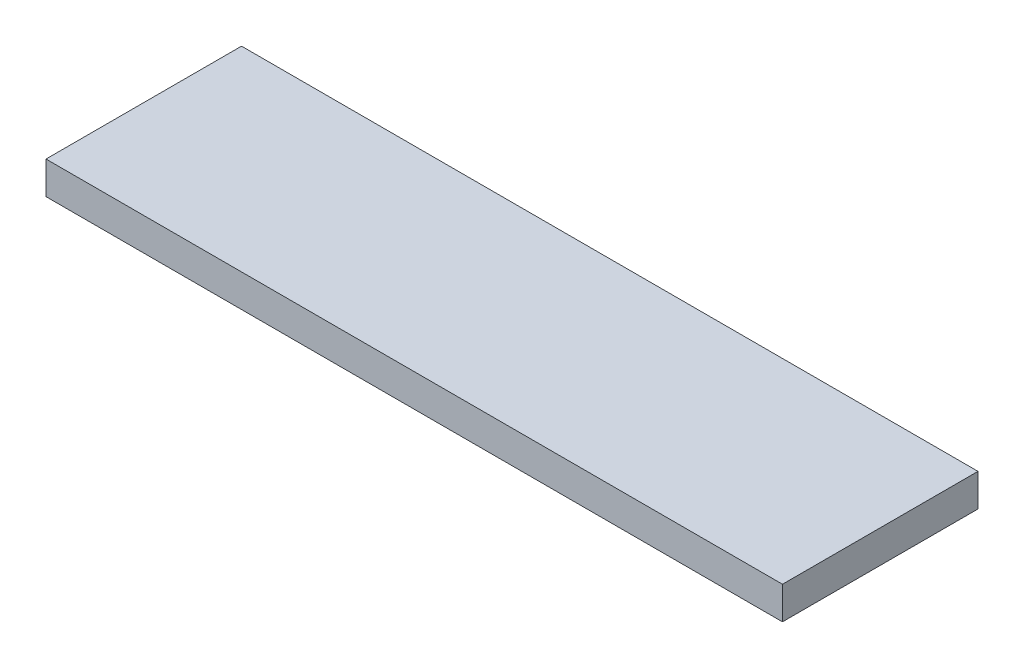
ISO-10303-21;
HEADER;
FILE_DESCRIPTION(('STEP AP214'),'2;1');
FILE_NAME('part.step','',(''),(''),'','','');
FILE_SCHEMA(('AUTOMOTIVE_DESIGN { 1 0 10303 214 1 1 1 1 }'));
ENDSEC;
DATA;
#1=APPLICATION_CONTEXT('core data for automotive mechanical design processes');
#2=APPLICATION_PROTOCOL_DEFINITION('international standard','automotive_design',2000,#1);
#3=PRODUCT_CONTEXT('',#1,'mechanical');
#4=PRODUCT('Part','Part','',(#3));
#5=PRODUCT_RELATED_PRODUCT_CATEGORY('part','',(#4));
#6=PRODUCT_DEFINITION_FORMATION('','',#4);
#7=PRODUCT_DEFINITION_CONTEXT('part definition',#1,'design');
#8=PRODUCT_DEFINITION('design','',#6,#7);
#9=PRODUCT_DEFINITION_SHAPE('','',#8);
#10=(LENGTH_UNIT() NAMED_UNIT(*) SI_UNIT(.MILLI.,.METRE.));
#11=(NAMED_UNIT(*) PLANE_ANGLE_UNIT() SI_UNIT($,.RADIAN.));
#12=(NAMED_UNIT(*) SI_UNIT($,.STERADIAN.) SOLID_ANGLE_UNIT());
#13=UNCERTAINTY_MEASURE_WITH_UNIT(LENGTH_MEASURE(1.E-05),#10,'distance_accuracy_value','');
#14=(GEOMETRIC_REPRESENTATION_CONTEXT(3) GLOBAL_UNCERTAINTY_ASSIGNED_CONTEXT((#13)) GLOBAL_UNIT_ASSIGNED_CONTEXT((#10,
#11,#12)) REPRESENTATION_CONTEXT('',''));
#15=CARTESIAN_POINT('',(0.,0.,0.));
#16=DIRECTION('',(0.,0.,1.));
#17=DIRECTION('',(1.,0.,0.));
#18=AXIS2_PLACEMENT_3D('',#15,#16,#17);
#19=CARTESIAN_POINT('',(113.,10.,30.));
#20=DIRECTION('',(-1.,0.,0.));
#21=DIRECTION('',(0.,0.,1.));
#22=AXIS2_PLACEMENT_3D('',#19,#20,#21);
#23=PLANE('',#22);
#24=DIRECTION('',(0.,0.,-1.));
#25=VECTOR('',#24,1.);
#26=CARTESIAN_POINT('',(113.,0.,30.));
#27=LINE('',#26,#25);
#28=CARTESIAN_POINT('',(113.,0.,30.));
#29=VERTEX_POINT('',#28);
#30=CARTESIAN_POINT('',(113.,0.,-30.));
#31=VERTEX_POINT('',#30);
#32=EDGE_CURVE('E107',#29,#31,#27,.T.);
#33=ORIENTED_EDGE('',*,*,#32,.T.);
#34=DIRECTION('',(0.,-1.,0.));
#35=VECTOR('',#34,1.);
#36=CARTESIAN_POINT('',(113.,10.,-30.));
#37=LINE('',#36,#35);
#38=CARTESIAN_POINT('',(113.,10.,-30.));
#39=VERTEX_POINT('',#38);
#40=EDGE_CURVE('E11',#39,#31,#37,.T.);
#41=ORIENTED_EDGE('',*,*,#40,.F.);
#42=DIRECTION('',(0.,0.,-1.));
#43=VECTOR('',#42,1.);
#44=CARTESIAN_POINT('',(113.,10.,30.));
#45=LINE('',#44,#43);
#46=CARTESIAN_POINT('',(113.,10.,30.));
#47=VERTEX_POINT('',#46);
#48=EDGE_CURVE('E91',#47,#39,#45,.T.);
#49=ORIENTED_EDGE('',*,*,#48,.F.);
#50=DIRECTION('',(0.,-1.,0.));
#51=VECTOR('',#50,1.);
#52=CARTESIAN_POINT('',(113.,10.,30.));
#53=LINE('',#52,#51);
#54=EDGE_CURVE('E103',#47,#29,#53,.T.);
#55=ORIENTED_EDGE('',*,*,#54,.T.);
#56=EDGE_LOOP('',(#33,#41,#49,#55));
#57=FACE_BOUND('',#56,.T.);
#58=ADVANCED_FACE('F39',(#57),#23,.F.);
#59=CARTESIAN_POINT('',(-113.,10.,-30.));
#60=DIRECTION('',(0.,0.,1.));
#61=DIRECTION('',(1.,0.,0.));
#62=AXIS2_PLACEMENT_3D('',#59,#60,#61);
#63=PLANE('',#62);
#64=DIRECTION('',(-1.,0.,0.));
#65=VECTOR('',#64,1.);
#66=CARTESIAN_POINT('',(-113.,0.,-30.));
#67=LINE('',#66,#65);
#68=CARTESIAN_POINT('',(-113.,0.,-30.));
#69=VERTEX_POINT('',#68);
#70=EDGE_CURVE('E96',#31,#69,#67,.T.);
#71=ORIENTED_EDGE('',*,*,#70,.T.);
#72=DIRECTION('',(0.,-1.,0.));
#73=VECTOR('',#72,1.);
#74=CARTESIAN_POINT('',(-113.,10.,-30.));
#75=LINE('',#74,#73);
#76=CARTESIAN_POINT('',(-113.,10.,-30.));
#77=VERTEX_POINT('',#76);
#78=EDGE_CURVE('E48',#77,#69,#75,.T.);
#79=ORIENTED_EDGE('',*,*,#78,.F.);
#80=DIRECTION('',(-1.,0.,0.));
#81=VECTOR('',#80,1.);
#82=CARTESIAN_POINT('',(-113.,10.,-30.));
#83=LINE('',#82,#81);
#84=EDGE_CURVE('E86',#39,#77,#83,.T.);
#85=ORIENTED_EDGE('',*,*,#84,.F.);
#86=ORIENTED_EDGE('',*,*,#40,.T.);
#87=EDGE_LOOP('',(#71,#79,#85,#86));
#88=FACE_BOUND('',#87,.T.);
#89=ADVANCED_FACE('F95',(#88),#63,.F.);
#90=CARTESIAN_POINT('',(-113.,10.,30.));
#91=DIRECTION('',(1.,0.,0.));
#92=DIRECTION('',(0.,0.,-1.));
#93=AXIS2_PLACEMENT_3D('',#90,#91,#92);
#94=PLANE('',#93);
#95=DIRECTION('',(0.,0.,1.));
#96=VECTOR('',#95,1.);
#97=CARTESIAN_POINT('',(-113.,0.,30.));
#98=LINE('',#97,#96);
#99=CARTESIAN_POINT('',(-113.,0.,30.));
#100=VERTEX_POINT('',#99);
#101=EDGE_CURVE('E73',#69,#100,#98,.T.);
#102=ORIENTED_EDGE('',*,*,#101,.T.);
#103=DIRECTION('',(0.,-1.,0.));
#104=VECTOR('',#103,1.);
#105=CARTESIAN_POINT('',(-113.,10.,30.));
#106=LINE('',#105,#104);
#107=CARTESIAN_POINT('',(-113.,10.,30.));
#108=VERTEX_POINT('',#107);
#109=EDGE_CURVE('E98',#108,#100,#106,.T.);
#110=ORIENTED_EDGE('',*,*,#109,.F.);
#111=DIRECTION('',(0.,0.,1.));
#112=VECTOR('',#111,1.);
#113=CARTESIAN_POINT('',(-113.,10.,30.));
#114=LINE('',#113,#112);
#115=EDGE_CURVE('E89',#77,#108,#114,.T.);
#116=ORIENTED_EDGE('',*,*,#115,.F.);
#117=ORIENTED_EDGE('',*,*,#78,.T.);
#118=EDGE_LOOP('',(#102,#110,#116,#117));
#119=FACE_BOUND('',#118,.T.);
#120=ADVANCED_FACE('F99',(#119),#94,.F.);
#121=CARTESIAN_POINT('',(-113.,10.,30.));
#122=DIRECTION('',(0.,0.,-1.));
#123=DIRECTION('',(-1.,0.,0.));
#124=AXIS2_PLACEMENT_3D('',#121,#122,#123);
#125=PLANE('',#124);
#126=DIRECTION('',(1.,0.,0.));
#127=VECTOR('',#126,1.);
#128=CARTESIAN_POINT('',(-113.,0.,30.));
#129=LINE('',#128,#127);
#130=EDGE_CURVE('E79',#100,#29,#129,.T.);
#131=ORIENTED_EDGE('',*,*,#130,.T.);
#132=ORIENTED_EDGE('',*,*,#54,.F.);
#133=DIRECTION('',(1.,0.,0.));
#134=VECTOR('',#133,1.);
#135=CARTESIAN_POINT('',(-113.,10.,30.));
#136=LINE('',#135,#134);
#137=EDGE_CURVE('E56',#108,#47,#136,.T.);
#138=ORIENTED_EDGE('',*,*,#137,.F.);
#139=ORIENTED_EDGE('',*,*,#109,.T.);
#140=EDGE_LOOP('',(#131,#132,#138,#139));
#141=FACE_BOUND('',#140,.T.);
#142=ADVANCED_FACE('F120',(#141),#125,.F.);
#143=CARTESIAN_POINT('',(0.,10.,0.));
#144=DIRECTION('',(0.,-1.,0.));
#145=DIRECTION('',(0.,0.,-1.));
#146=AXIS2_PLACEMENT_3D('',#143,#144,#145);
#147=PLANE('',#146);
#148=ORIENTED_EDGE('',*,*,#48,.T.);
#149=ORIENTED_EDGE('',*,*,#84,.T.);
#150=ORIENTED_EDGE('',*,*,#115,.T.);
#151=ORIENTED_EDGE('',*,*,#137,.T.);
#152=EDGE_LOOP('',(#148,#149,#150,#151));
#153=FACE_BOUND('',#152,.T.);
#154=ADVANCED_FACE('F87',(#153),#147,.F.);
#155=CARTESIAN_POINT('',(0.,0.,0.));
#156=DIRECTION('',(0.,-1.,0.));
#157=DIRECTION('',(0.,0.,-1.));
#158=AXIS2_PLACEMENT_3D('',#155,#156,#157);
#159=PLANE('',#158);
#160=ORIENTED_EDGE('',*,*,#32,.F.);
#161=ORIENTED_EDGE('',*,*,#130,.F.);
#162=ORIENTED_EDGE('',*,*,#101,.F.);
#163=ORIENTED_EDGE('',*,*,#70,.F.);
#164=EDGE_LOOP('',(#160,#161,#162,#163));
#165=FACE_BOUND('',#164,.T.);
#166=ADVANCED_FACE('F123',(#165),#159,.T.);
#167=CLOSED_SHELL('',(#58,#89,#120,#142,#154,#166));
#168=MANIFOLD_SOLID_BREP('B2',#167);
#169=ADVANCED_BREP_SHAPE_REPRESENTATION('',(#18,#168),#14);
#170=SHAPE_DEFINITION_REPRESENTATION(#9,#169);
ENDSEC;
END-ISO-10303-21;
